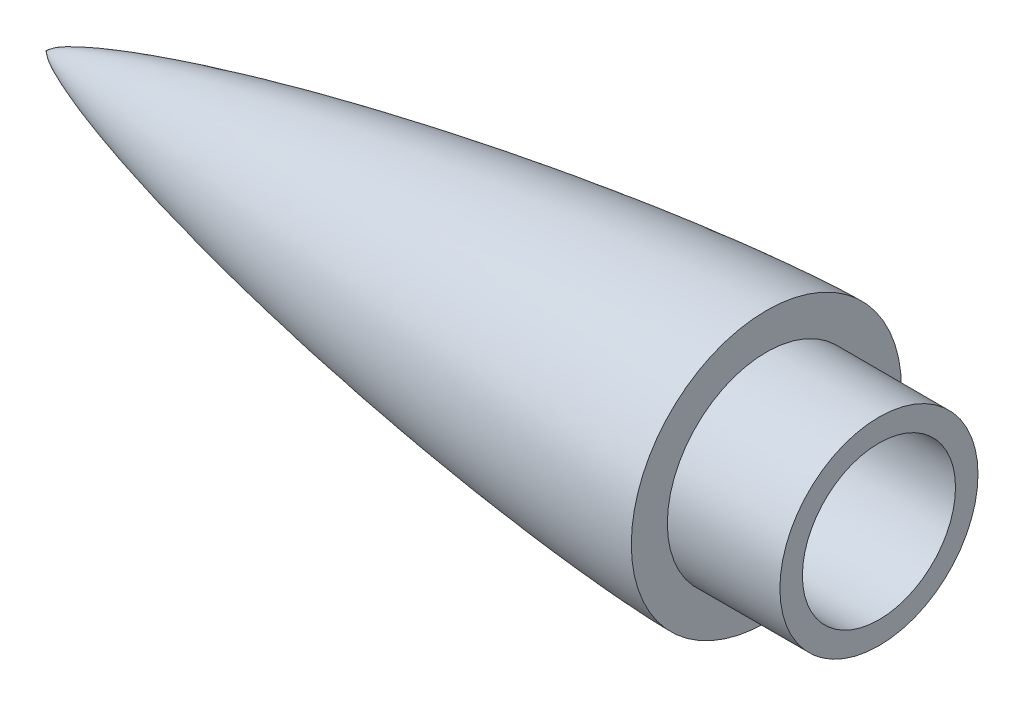
ISO-10303-21;
HEADER;
FILE_DESCRIPTION(('STEP AP214'),'2;1');
FILE_NAME('part.step','',(''),(''),'','','');
FILE_SCHEMA(('AUTOMOTIVE_DESIGN { 1 0 10303 214 1 1 1 1 }'));
ENDSEC;
DATA;
#1=APPLICATION_CONTEXT('core data for automotive mechanical design processes');
#2=APPLICATION_PROTOCOL_DEFINITION('international standard','automotive_design',2000,#1);
#3=PRODUCT_CONTEXT('',#1,'mechanical');
#4=PRODUCT('Part','Part','',(#3));
#5=PRODUCT_RELATED_PRODUCT_CATEGORY('part','',(#4));
#6=PRODUCT_DEFINITION_FORMATION('','',#4);
#7=PRODUCT_DEFINITION_CONTEXT('part definition',#1,'design');
#8=PRODUCT_DEFINITION('design','',#6,#7);
#9=PRODUCT_DEFINITION_SHAPE('','',#8);
#10=(LENGTH_UNIT() NAMED_UNIT(*) SI_UNIT(.MILLI.,.METRE.));
#11=(NAMED_UNIT(*) PLANE_ANGLE_UNIT() SI_UNIT($,.RADIAN.));
#12=(NAMED_UNIT(*) SI_UNIT($,.STERADIAN.) SOLID_ANGLE_UNIT());
#13=UNCERTAINTY_MEASURE_WITH_UNIT(LENGTH_MEASURE(1.E-05),#10,'distance_accuracy_value','');
#14=(GEOMETRIC_REPRESENTATION_CONTEXT(3) GLOBAL_UNCERTAINTY_ASSIGNED_CONTEXT((#13)) GLOBAL_UNIT_ASSIGNED_CONTEXT((#10,
#11,#12)) REPRESENTATION_CONTEXT('',''));
#15=CARTESIAN_POINT('',(0.,0.,0.));
#16=DIRECTION('',(0.,0.,1.));
#17=DIRECTION('',(1.,0.,0.));
#18=AXIS2_PLACEMENT_3D('',#15,#16,#17);
#19=CARTESIAN_POINT('',(203.2,38.1,0.));
#20=CARTESIAN_POINT('',(202.35327221032,38.0874213958234,0.));
#21=CARTESIAN_POINT('',(200.659520424033,38.0622597871542,0.));
#22=CARTESIAN_POINT('',(198.119532419599,37.9765799413632,0.));
#23=CARTESIAN_POINT('',(195.57959488154,37.8693159241633,0.));
#24=CARTESIAN_POINT('',(193.039628096979,37.7439638941085,0.));
#25=CARTESIAN_POINT('',(190.499433916601,37.6058607955,0.));
#26=CARTESIAN_POINT('',(187.959738312947,37.4453828045326,0.));
#27=CARTESIAN_POINT('',(185.41940740923,37.2805467532104,0.));
#28=CARTESIAN_POINT('',(182.879788526047,37.0944738883826,0.));
#29=CARTESIAN_POINT('',(180.33946372681,36.9063722468724,0.));
#30=CARTESIAN_POINT('',(177.799612105554,36.7017846900842,0.));
#31=CARTESIAN_POINT('',(175.259541694417,36.4890398775095,0.));
#32=CARTESIAN_POINT('',(172.719695975823,36.2644385209909,0.));
#33=CARTESIAN_POINT('',(170.179494349826,36.0344909493732,0.));
#34=CARTESIAN_POINT('',(167.639672440266,35.7919907975904,0.));
#35=CARTESIAN_POINT('',(165.09946837173,35.544159250664,0.));
#36=CARTESIAN_POINT('',(162.559603902815,35.2844073808833,0.));
#37=CARTESIAN_POINT('',(160.019782602626,35.0168092256419,0.));
#38=CARTESIAN_POINT('',(157.479398199388,34.746798042537,0.));
#39=CARTESIAN_POINT('',(154.939611185303,34.463630203018,0.));
#40=CARTESIAN_POINT('',(152.399527555006,34.1747050969731,0.));
#41=CARTESIAN_POINT('',(149.859772854648,33.876219817742,0.));
#42=CARTESIAN_POINT('',(147.319308064184,33.5760513179554,0.));
#43=CARTESIAN_POINT('',(144.779763921123,33.2615039153627,0.));
#44=CARTESIAN_POINT('',(142.239468652528,32.9454639692837,0.));
#45=CARTESIAN_POINT('',(139.699726053804,32.6191069300651,0.));
#46=CARTESIAN_POINT('',(137.159478506353,32.2899110321884,0.));
#47=CARTESIAN_POINT('',(134.619511087876,31.9517544969504,0.));
#48=CARTESIAN_POINT('',(132.079457119206,31.6066247539575,0.));
#49=CARTESIAN_POINT('',(129.539693062872,31.252658291611,0.));
#50=CARTESIAN_POINT('',(126.999445544764,30.8953765389603,0.));
#51=CARTESIAN_POINT('',(124.459447008919,30.5295172358954,0.));
#52=CARTESIAN_POINT('',(121.919633165503,30.1556584295223,0.));
#53=CARTESIAN_POINT('',(119.379693423668,29.7767843502303,0.));
#54=CARTESIAN_POINT('',(116.839102450566,29.3953513087696,0.));
#55=CARTESIAN_POINT('',(114.299975806128,28.9984900317736,0.));
#56=CARTESIAN_POINT('',(111.759066101772,28.6054687620931,0.));
#57=CARTESIAN_POINT('',(109.219710980277,28.1966354373702,0.));
#58=CARTESIAN_POINT('',(106.679303419832,27.7867804080981,0.));
#59=CARTESIAN_POINT('',(104.139704710616,27.3660518151296,0.));
#60=CARTESIAN_POINT('',(101.599001733031,26.9442953677879,0.));
#61=CARTESIAN_POINT('',(99.0599787123121,26.5067180778773,0.));
#62=CARTESIAN_POINT('',(96.5189676014558,26.0731094879401,0.));
#63=CARTESIAN_POINT('',(93.979715377483,25.6234323083014,0.));
#64=CARTESIAN_POINT('',(91.438974155588,25.1737153098106,0.));
#65=CARTESIAN_POINT('',(88.8996642393873,24.7092563693429,0.));
#66=CARTESIAN_POINT('',(86.3592242289511,24.2434033277482,0.));
#67=CARTESIAN_POINT('',(83.8196430482231,23.766986240292,0.));
#68=CARTESIAN_POINT('',(81.2789714656036,23.2887242795363,0.));
#69=CARTESIAN_POINT('',(78.7393187855271,22.7974529378229,0.));
#70=CARTESIAN_POINT('',(76.1993146199525,22.2995998220212,0.));
#71=CARTESIAN_POINT('',(73.6589123875606,21.7952177722481,0.));
#72=CARTESIAN_POINT('',(71.1196416290707,21.2776442591767,0.));
#73=CARTESIAN_POINT('',(68.5788730797881,20.7589410297143,0.));
#74=CARTESIAN_POINT('',(66.0393165771156,20.2267231686094,0.));
#75=CARTESIAN_POINT('',(63.4989115312543,19.6892441393695,0.));
#76=CARTESIAN_POINT('',(60.9589691573658,19.1402421077224,0.));
#77=CARTESIAN_POINT('',(58.4188686923172,18.5818045967568,0.));
#78=CARTESIAN_POINT('',(55.879290862722,18.0117480094025,0.));
#79=CARTESIAN_POINT('',(53.3385126434733,17.4368137050718,0.));
#80=CARTESIAN_POINT('',(50.7989012260591,16.8465774296985,0.));
#81=CARTESIAN_POINT('',(48.2589378728255,16.2469301167611,0.));
#82=CARTESIAN_POINT('',(45.7180895628018,15.6390165023082,0.));
#83=CARTESIAN_POINT('',(43.1789907495377,15.0120826942404,0.));
#84=CARTESIAN_POINT('',(40.6380352515663,14.3790903419921,0.));
#85=CARTESIAN_POINT('',(38.0985953262379,13.7273572736047,0.));
#86=CARTESIAN_POINT('',(35.557729537105,13.0658929841941,0.));
#87=CARTESIAN_POINT('',(33.0177048142457,12.3850121370449,0.));
#88=CARTESIAN_POINT('',(30.4781859829415,11.6854540622966,0.));
#89=CARTESIAN_POINT('',(27.9368627464543,10.9736458090148,0.));
#90=CARTESIAN_POINT('',(25.3969033448791,10.2365404000852,0.));
#91=CARTESIAN_POINT('',(22.8569404975014,9.47667598927694,0.));
#92=CARTESIAN_POINT('',(20.3155382178336,8.69595038680452,0.));
#93=CARTESIAN_POINT('',(17.7752083185613,7.88273485640195,0.));
#94=CARTESIAN_POINT('',(15.2338471259066,7.03786564324004,0.));
#95=CARTESIAN_POINT('',(12.6917846130751,6.1525424530211,0.));
#96=CARTESIAN_POINT('',(10.1498176031452,5.21509463858698,0.));
#97=CARTESIAN_POINT('',(7.60101138969957,4.21844923300136,0.));
#98=CARTESIAN_POINT('',(5.31163155333795,3.21455412238019,0.));
#99=CARTESIAN_POINT('',(3.85043781881059,2.56181745659905,0.));
#100=CARTESIAN_POINT('',(3.25635969447798,2.25175212869138,0.));
#101=B_SPLINE_CURVE_WITH_KNOTS('',3,(#19,#20,#21,#22,#23,#24,#25,#26,#27,#28,#29,#30,#31,#32,
#33,#34,#35,#36,#37,#38,#39,#40,#41,#42,#43,#44,#45,#46,#47,#48,#49,#50,#51,#52,#53,#54,#55,#56,
#57,#58,#59,#60,#61,#62,#63,#64,#65,#66,#67,#68,#69,#70,#71,#72,#73,#74,#75,#76,#77,#78,#79,#80,
#81,#82,#83,#84,#85,#86,#87,#88,#89,#90,#91,#92,#93,#94,#95,#96,#97,#98,#99,#100),.UNSPECIFIED.,
.F.,.F.,(4,1,1,1,1,1,1,1,1,1,1,1,1,1,1,1,1,1,1,1,1,1,1,1,1,1,1,1,1,1,1,1,1,1,1,1,1,1,1,1,1,1,1,
1,1,1,1,1,1,1,1,1,1,1,1,1,1,1,1,1,1,1,1,1,1,1,1,1,1,1,1,1,1,1,1,1,1,1,1,4),(0.,
0.0122214576910475,0.0244471907590049,0.0366774418860184,0.0489115808707918,0.0611495271717135,
0.0733924687782657,0.085638532178157,0.0978896424197724,0.110143439804819,0.122401958066926,
0.134664470902747,0.146931171772001,0.159201140505446,0.171475635344876,0.183753651362312,
0.196036530904353,0.208323184430144,0.220612414051986,0.232906939986116,0.24520556413716,
0.257508394370645,0.269814088529882,0.282125654079791,0.294440227026184,0.306759400595471,
0.31908170088014,0.331408780597301,0.34374074686723,0.356077706682913,0.36841805490562,
0.380763574705866,0.39311437272464,0.405468748733377,0.417826750026271,0.430192143603126,
0.442559414744232,0.454934313954287,0.467313097809637,0.479697796772066,0.492086497833172,
0.504483343752196,0.516882255156344,0.529289545408145,0.541701095145086,0.55412130373465,
0.566545911594214,0.578977205524542,0.591413014872987,0.60385799412021,0.616309972269369,
0.62876905324961,0.641237766031493,0.653711363748566,0.666194869134613,0.67868592563073,
0.691187210395973,0.703698906015472,0.716221194618961,0.728751547205512,0.741295566312625,
0.753850721996889,0.766417194503259,0.7790009791362,0.791596529062166,0.804210061487715,
0.816838884916885,0.829489580433592,0.842162687623285,0.85485543211962,0.867578367943308,
0.880332371951203,0.893118314608214,0.905948184925776,0.91882735853734,0.931769632112245,
0.944794478292494,0.957932690655188,0.971243646055015,0.980922397956935),.UNSPECIFIED.);
#102=CARTESIAN_POINT('',(0.,0.,0.));
#103=DIRECTION('',(-1.,0.,0.));
#104=AXIS1_PLACEMENT('',#102,#103);
#105=SURFACE_OF_REVOLUTION('',#101,#104);
#106=OFFSET_SURFACE('',#105,-2.54,.F.);
#107=CARTESIAN_POINT('',(197.355554907475,0.,0.));
#108=DIRECTION('',(-1.,0.,0.));
#109=DIRECTION('',(0.,0.,1.));
#110=AXIS2_PLACEMENT_3D('',#107,#108,#109);
#111=CIRCLE('',#110,35.4009078823519);
#112=CARTESIAN_POINT('',(197.355554907475,0.,35.4009078823519));
#113=VERTEX_POINT('',#112);
#114=EDGE_CURVE('E12',#113,#113,#111,.F.);
#115=ORIENTED_EDGE('',*,*,#114,.T.);
#116=EDGE_LOOP('',(#115));
#117=FACE_BOUND('',#116,.T.);
#118=CARTESIAN_POINT('',(4.4316096044689,0.,0.));
#119=VERTEX_POINT('',#118);
#120=VERTEX_LOOP('',#119);
#121=FACE_BOUND('',#120,.T.);
#122=ADVANCED_FACE('F42',(#117,#121),#106,.F.);
#123=CARTESIAN_POINT('',(200.66,0.,0.));
#124=DIRECTION('',(-1.,0.,0.));
#125=DIRECTION('',(0.,0.,1.));
#126=AXIS2_PLACEMENT_3D('',#123,#124,#125);
#127=PLANE('',#126);
#128=CARTESIAN_POINT('',(200.66,0.,0.));
#129=DIRECTION('',(-1.,0.,0.));
#130=DIRECTION('',(0.,0.,1.));
#131=AXIS2_PLACEMENT_3D('',#128,#129,#130);
#132=CIRCLE('',#131,24.765);
#133=CARTESIAN_POINT('',(200.66,0.,24.765));
#134=VERTEX_POINT('',#133);
#135=EDGE_CURVE('E117',#134,#134,#132,.F.);
#136=ORIENTED_EDGE('',*,*,#135,.T.);
#137=EDGE_LOOP('',(#136));
#138=FACE_BOUND('',#137,.T.);
#139=CARTESIAN_POINT('',(200.66,0.,0.));
#140=DIRECTION('',(-1.,0.,0.));
#141=DIRECTION('',(0.,0.,1.));
#142=AXIS2_PLACEMENT_3D('',#139,#140,#141);
#143=CIRCLE('',#142,32.2285477249893);
#144=CARTESIAN_POINT('',(200.66,0.,32.2285477249893));
#145=VERTEX_POINT('',#144);
#146=EDGE_CURVE('E70',#145,#145,#143,.T.);
#147=ORIENTED_EDGE('',*,*,#146,.T.);
#148=EDGE_LOOP('',(#147));
#149=FACE_BOUND('',#148,.T.);
#150=ADVANCED_FACE('F60',(#138,#149),#127,.T.);
#151=CARTESIAN_POINT('',(203.2,38.1,0.));
#152=CARTESIAN_POINT('',(202.35327221032,38.0874213958234,0.));
#153=CARTESIAN_POINT('',(200.659520424033,38.0622597871542,0.));
#154=CARTESIAN_POINT('',(198.119532419599,37.9765799413632,0.));
#155=CARTESIAN_POINT('',(195.57959488154,37.8693159241633,0.));
#156=CARTESIAN_POINT('',(193.039628096979,37.7439638941085,0.));
#157=CARTESIAN_POINT('',(190.499433916601,37.6058607955,0.));
#158=CARTESIAN_POINT('',(187.959738312947,37.4453828045326,0.));
#159=CARTESIAN_POINT('',(185.41940740923,37.2805467532104,0.));
#160=CARTESIAN_POINT('',(182.879788526047,37.0944738883826,0.));
#161=CARTESIAN_POINT('',(180.33946372681,36.9063722468724,0.));
#162=CARTESIAN_POINT('',(177.799612105554,36.7017846900842,0.));
#163=CARTESIAN_POINT('',(175.259541694417,36.4890398775095,0.));
#164=CARTESIAN_POINT('',(172.719695975823,36.2644385209909,0.));
#165=CARTESIAN_POINT('',(170.179494349826,36.0344909493732,0.));
#166=CARTESIAN_POINT('',(167.639672440266,35.7919907975904,0.));
#167=CARTESIAN_POINT('',(165.09946837173,35.544159250664,0.));
#168=CARTESIAN_POINT('',(162.559603902815,35.2844073808833,0.));
#169=CARTESIAN_POINT('',(160.019782602626,35.0168092256419,0.));
#170=CARTESIAN_POINT('',(157.479398199388,34.746798042537,0.));
#171=CARTESIAN_POINT('',(154.939611185303,34.463630203018,0.));
#172=CARTESIAN_POINT('',(152.399527555006,34.1747050969731,0.));
#173=CARTESIAN_POINT('',(149.859772854648,33.876219817742,0.));
#174=CARTESIAN_POINT('',(147.319308064184,33.5760513179554,0.));
#175=CARTESIAN_POINT('',(144.779763921123,33.2615039153627,0.));
#176=CARTESIAN_POINT('',(142.239468652528,32.9454639692837,0.));
#177=CARTESIAN_POINT('',(139.699726053804,32.6191069300651,0.));
#178=CARTESIAN_POINT('',(137.159478506353,32.2899110321884,0.));
#179=CARTESIAN_POINT('',(134.619511087876,31.9517544969504,0.));
#180=CARTESIAN_POINT('',(132.079457119206,31.6066247539575,0.));
#181=CARTESIAN_POINT('',(129.539693062872,31.252658291611,0.));
#182=CARTESIAN_POINT('',(126.999445544764,30.8953765389603,0.));
#183=CARTESIAN_POINT('',(124.459447008919,30.5295172358954,0.));
#184=CARTESIAN_POINT('',(121.919633165503,30.1556584295223,0.));
#185=CARTESIAN_POINT('',(119.379693423668,29.7767843502303,0.));
#186=CARTESIAN_POINT('',(116.839102450566,29.3953513087696,0.));
#187=CARTESIAN_POINT('',(114.299975806128,28.9984900317736,0.));
#188=CARTESIAN_POINT('',(111.759066101772,28.6054687620931,0.));
#189=CARTESIAN_POINT('',(109.219710980277,28.1966354373702,0.));
#190=CARTESIAN_POINT('',(106.679303419832,27.7867804080981,0.));
#191=CARTESIAN_POINT('',(104.139704710616,27.3660518151296,0.));
#192=CARTESIAN_POINT('',(101.599001733031,26.9442953677879,0.));
#193=CARTESIAN_POINT('',(99.0599787123121,26.5067180778773,0.));
#194=CARTESIAN_POINT('',(96.5189676014558,26.0731094879401,0.));
#195=CARTESIAN_POINT('',(93.979715377483,25.6234323083014,0.));
#196=CARTESIAN_POINT('',(91.438974155588,25.1737153098106,0.));
#197=CARTESIAN_POINT('',(88.8996642393873,24.7092563693429,0.));
#198=CARTESIAN_POINT('',(86.3592242289511,24.2434033277482,0.));
#199=CARTESIAN_POINT('',(83.8196430482231,23.766986240292,0.));
#200=CARTESIAN_POINT('',(81.2789714656036,23.2887242795363,0.));
#201=CARTESIAN_POINT('',(78.7393187855271,22.7974529378229,0.));
#202=CARTESIAN_POINT('',(76.1993146199525,22.2995998220212,0.));
#203=CARTESIAN_POINT('',(73.6589123875606,21.7952177722481,0.));
#204=CARTESIAN_POINT('',(71.1196416290707,21.2776442591767,0.));
#205=CARTESIAN_POINT('',(68.5788730797881,20.7589410297143,0.));
#206=CARTESIAN_POINT('',(66.0393165771156,20.2267231686094,0.));
#207=CARTESIAN_POINT('',(63.4989115312543,19.6892441393695,0.));
#208=CARTESIAN_POINT('',(60.9589691573658,19.1402421077224,0.));
#209=CARTESIAN_POINT('',(58.4188686923172,18.5818045967568,0.));
#210=CARTESIAN_POINT('',(55.879290862722,18.0117480094025,0.));
#211=CARTESIAN_POINT('',(53.3385126434733,17.4368137050718,0.));
#212=CARTESIAN_POINT('',(50.7989012260591,16.8465774296985,0.));
#213=CARTESIAN_POINT('',(48.2589378728255,16.2469301167611,0.));
#214=CARTESIAN_POINT('',(45.7180895628018,15.6390165023082,0.));
#215=CARTESIAN_POINT('',(43.1789907495377,15.0120826942404,0.));
#216=CARTESIAN_POINT('',(40.6380352515663,14.3790903419921,0.));
#217=CARTESIAN_POINT('',(38.0985953262379,13.7273572736047,0.));
#218=CARTESIAN_POINT('',(35.557729537105,13.0658929841941,0.));
#219=CARTESIAN_POINT('',(33.0177048142457,12.3850121370449,0.));
#220=CARTESIAN_POINT('',(30.4781859829415,11.6854540622966,0.));
#221=CARTESIAN_POINT('',(27.9368627464543,10.9736458090148,0.));
#222=CARTESIAN_POINT('',(25.3969033448791,10.2365404000852,0.));
#223=CARTESIAN_POINT('',(22.8569404975014,9.47667598927694,0.));
#224=CARTESIAN_POINT('',(20.3155382178336,8.69595038680452,0.));
#225=CARTESIAN_POINT('',(17.7752083185613,7.88273485640195,0.));
#226=CARTESIAN_POINT('',(15.2338471259066,7.03786564324004,0.));
#227=CARTESIAN_POINT('',(12.6917846130751,6.1525424530211,0.));
#228=CARTESIAN_POINT('',(10.1498176031452,5.21509463858698,0.));
#229=CARTESIAN_POINT('',(7.60101138969957,4.21844923300136,0.));
#230=CARTESIAN_POINT('',(5.06095593839421,3.10463264050241,0.));
#231=CARTESIAN_POINT('',(2.38584190073711,1.90585236842649,0.));
#232=CARTESIAN_POINT('',(0.822235741854195,0.656816336209697,0.));
#233=CARTESIAN_POINT('',(0.,0.,0.));
#234=B_SPLINE_CURVE_WITH_KNOTS('',3,(#151,#152,#153,#154,#155,#156,#157,#158,#159,#160,#161,
#162,#163,#164,#165,#166,#167,#168,#169,#170,#171,#172,#173,#174,#175,#176,#177,#178,#179,#180,
#181,#182,#183,#184,#185,#186,#187,#188,#189,#190,#191,#192,#193,#194,#195,#196,#197,#198,#199,
#200,#201,#202,#203,#204,#205,#206,#207,#208,#209,#210,#211,#212,#213,#214,#215,#216,#217,#218,
#219,#220,#221,#222,#223,#224,#225,#226,#227,#228,#229,#230,#231,#232,#233),.UNSPECIFIED.,.F.,
.F.,(4,1,1,1,1,1,1,1,1,1,1,1,1,1,1,1,1,1,1,1,1,1,1,1,1,1,1,1,1,1,1,1,1,1,1,1,1,1,1,1,1,1,1,1,1,
1,1,1,1,1,1,1,1,1,1,1,1,1,1,1,1,1,1,1,1,1,1,1,1,1,1,1,1,1,1,1,1,1,1,1,4),(0.,0.0122214576910475,
0.0244471907590049,0.0366774418860184,0.0489115808707918,0.0611495271717135,0.0733924687782657,
0.085638532178157,0.0978896424197724,0.110143439804819,0.122401958066926,0.134664470902747,
0.146931171772001,0.159201140505446,0.171475635344876,0.183753651362312,0.196036530904353,
0.208323184430144,0.220612414051986,0.232906939986116,0.24520556413716,0.257508394370645,
0.269814088529882,0.282125654079791,0.294440227026184,0.306759400595471,0.31908170088014,
0.331408780597301,0.34374074686723,0.356077706682913,0.36841805490562,0.380763574705866,
0.39311437272464,0.405468748733377,0.417826750026271,0.430192143603126,0.442559414744232,
0.454934313954287,0.467313097809637,0.479697796772066,0.492086497833172,0.504483343752196,
0.516882255156344,0.529289545408145,0.541701095145086,0.55412130373465,0.566545911594214,
0.578977205524542,0.591413014872987,0.60385799412021,0.616309972269369,0.62876905324961,
0.641237766031493,0.653711363748566,0.666194869134613,0.67868592563073,0.691187210395973,
0.703698906015472,0.716221194618961,0.728751547205512,0.741295566312625,0.753850721996889,
0.766417194503259,0.7790009791362,0.791596529062166,0.804210061487715,0.816838884916885,
0.829489580433592,0.842162687623285,0.85485543211962,0.867578367943308,0.880332371951203,
0.893118314608214,0.905948184925776,0.91882735853734,0.931769632112245,0.944794478292494,
0.957932690655188,0.971243646055015,0.984878224043407,1.),.UNSPECIFIED.);
#235=CARTESIAN_POINT('',(0.,0.,0.));
#236=DIRECTION('',(-1.,0.,0.));
#237=AXIS1_PLACEMENT('',#235,#236);
#238=SURFACE_OF_REVOLUTION('',#234,#237);
#239=CARTESIAN_POINT('',(0.,0.,0.));
#240=VERTEX_POINT('',#239);
#241=VERTEX_LOOP('',#240);
#242=FACE_BOUND('',#241,.T.);
#243=CARTESIAN_POINT('',(203.2,0.,0.));
#244=DIRECTION('',(-1.,0.,0.));
#245=DIRECTION('',(0.,0.,1.));
#246=AXIS2_PLACEMENT_3D('',#243,#244,#245);
#247=CIRCLE('',#246,38.1);
#248=CARTESIAN_POINT('',(203.2,0.,38.1));
#249=VERTEX_POINT('',#248);
#250=EDGE_CURVE('E64',#249,#249,#247,.T.);
#251=ORIENTED_EDGE('',*,*,#250,.T.);
#252=EDGE_LOOP('',(#251));
#253=FACE_BOUND('',#252,.T.);
#254=ADVANCED_FACE('F56',(#242,#253),#238,.T.);
#255=CARTESIAN_POINT('',(203.2,0.,0.));
#256=DIRECTION('',(-1.,0.,0.));
#257=DIRECTION('',(0.,0.,1.));
#258=AXIS2_PLACEMENT_3D('',#255,#256,#257);
#259=PLANE('',#258);
#260=CARTESIAN_POINT('',(203.2,0.,0.));
#261=DIRECTION('',(-1.,0.,0.));
#262=DIRECTION('',(0.,0.,1.));
#263=AXIS2_PLACEMENT_3D('',#260,#261,#262);
#264=CIRCLE('',#263,27.94);
#265=CARTESIAN_POINT('',(203.2,0.,27.94));
#266=VERTEX_POINT('',#265);
#267=EDGE_CURVE('E66',#266,#266,#264,.F.);
#268=ORIENTED_EDGE('',*,*,#267,.F.);
#269=EDGE_LOOP('',(#268));
#270=FACE_BOUND('',#269,.T.);
#271=ORIENTED_EDGE('',*,*,#250,.F.);
#272=EDGE_LOOP('',(#271));
#273=FACE_BOUND('',#272,.T.);
#274=ADVANCED_FACE('F59',(#270,#273),#259,.F.);
#275=CARTESIAN_POINT('',(234.95,0.,0.));
#276=DIRECTION('',(1.,0.,0.));
#277=DIRECTION('',(0.,0.,-1.));
#278=AXIS2_PLACEMENT_3D('',#275,#276,#277);
#279=PLANE('',#278);
#280=CARTESIAN_POINT('',(234.95,0.,0.));
#281=DIRECTION('',(1.,0.,0.));
#282=DIRECTION('',(0.,0.,-1.));
#283=AXIS2_PLACEMENT_3D('',#280,#281,#282);
#284=CIRCLE('',#283,27.94);
#285=CARTESIAN_POINT('',(234.95,0.,-27.94));
#286=VERTEX_POINT('',#285);
#287=EDGE_CURVE('E67',#286,#286,#284,.T.);
#288=ORIENTED_EDGE('',*,*,#287,.T.);
#289=EDGE_LOOP('',(#288));
#290=FACE_BOUND('',#289,.T.);
#291=CARTESIAN_POINT('',(234.95,0.,0.));
#292=DIRECTION('',(1.,0.,0.));
#293=DIRECTION('',(0.,0.,-1.));
#294=AXIS2_PLACEMENT_3D('',#291,#292,#293);
#295=CIRCLE('',#294,21.59);
#296=CARTESIAN_POINT('',(234.95,0.,-21.59));
#297=VERTEX_POINT('',#296);
#298=EDGE_CURVE('E73',#297,#297,#295,.T.);
#299=ORIENTED_EDGE('',*,*,#298,.F.);
#300=EDGE_LOOP('',(#299));
#301=FACE_BOUND('',#300,.T.);
#302=ADVANCED_FACE('F126',(#290,#301),#279,.T.);
#303=CARTESIAN_POINT('',(234.95,0.,0.));
#304=DIRECTION('',(-1.,0.,0.));
#305=DIRECTION('',(0.,0.,1.));
#306=AXIS2_PLACEMENT_3D('',#303,#304,#305);
#307=CYLINDRICAL_SURFACE('',#306,27.94);
#308=ORIENTED_EDGE('',*,*,#287,.F.);
#309=EDGE_LOOP('',(#308));
#310=FACE_BOUND('',#309,.T.);
#311=ORIENTED_EDGE('',*,*,#267,.T.);
#312=EDGE_LOOP('',(#311));
#313=FACE_BOUND('',#312,.T.);
#314=ADVANCED_FACE('F102',(#310,#313),#307,.T.);
#315=CARTESIAN_POINT('',(234.95,0.,0.));
#316=DIRECTION('',(-1.,0.,0.));
#317=DIRECTION('',(0.,0.,1.));
#318=AXIS2_PLACEMENT_3D('',#315,#316,#317);
#319=CYLINDRICAL_SURFACE('',#318,21.59);
#320=CARTESIAN_POINT('',(203.835,0.,0.));
#321=DIRECTION('',(-1.,0.,0.));
#322=DIRECTION('',(0.,0.,1.));
#323=AXIS2_PLACEMENT_3D('',#320,#321,#322);
#324=CIRCLE('',#323,21.59);
#325=CARTESIAN_POINT('',(203.835,0.,21.59));
#326=VERTEX_POINT('',#325);
#327=EDGE_CURVE('E50',#326,#326,#324,.T.);
#328=ORIENTED_EDGE('',*,*,#327,.T.);
#329=EDGE_LOOP('',(#328));
#330=FACE_BOUND('',#329,.T.);
#331=ORIENTED_EDGE('',*,*,#298,.T.);
#332=EDGE_LOOP('',(#331));
#333=FACE_BOUND('',#332,.T.);
#334=ADVANCED_FACE('F95',(#330,#333),#319,.F.);
#335=CARTESIAN_POINT('',(203.835,0.,0.));
#336=DIRECTION('',(-1.,0.,0.));
#337=DIRECTION('',(0.,0.,1.));
#338=AXIS2_PLACEMENT_3D('',#335,#336,#337);
#339=TOROIDAL_SURFACE('',#338,24.765,3.175);
#340=ORIENTED_EDGE('',*,*,#327,.F.);
#341=EDGE_LOOP('',(#340));
#342=FACE_BOUND('',#341,.T.);
#343=ORIENTED_EDGE('',*,*,#135,.F.);
#344=EDGE_LOOP('',(#343));
#345=FACE_BOUND('',#344,.T.);
#346=ADVANCED_FACE('F93',(#342,#345),#339,.T.);
#347=CARTESIAN_POINT('',(197.485,0.,0.));
#348=DIRECTION('',(-1.,0.,0.));
#349=DIRECTION('',(0.,0.,1.));
#350=AXIS2_PLACEMENT_3D('',#347,#348,#349);
#351=TOROIDAL_SURFACE('',#350,32.2285477249893,3.175);
#352=ORIENTED_EDGE('',*,*,#114,.F.);
#353=EDGE_LOOP('',(#352));
#354=FACE_BOUND('',#353,.T.);
#355=ORIENTED_EDGE('',*,*,#146,.F.);
#356=EDGE_LOOP('',(#355));
#357=FACE_BOUND('',#356,.T.);
#358=ADVANCED_FACE('F44',(#354,#357),#351,.F.);
#359=CLOSED_SHELL('',(#122,#150,#254,#274,#302,#314,#334,#346,#358));
#360=MANIFOLD_SOLID_BREP('B2',#359);
#361=ADVANCED_BREP_SHAPE_REPRESENTATION('',(#18,#360),#14);
#362=SHAPE_DEFINITION_REPRESENTATION(#9,#361);
ENDSEC;
END-ISO-10303-21;
